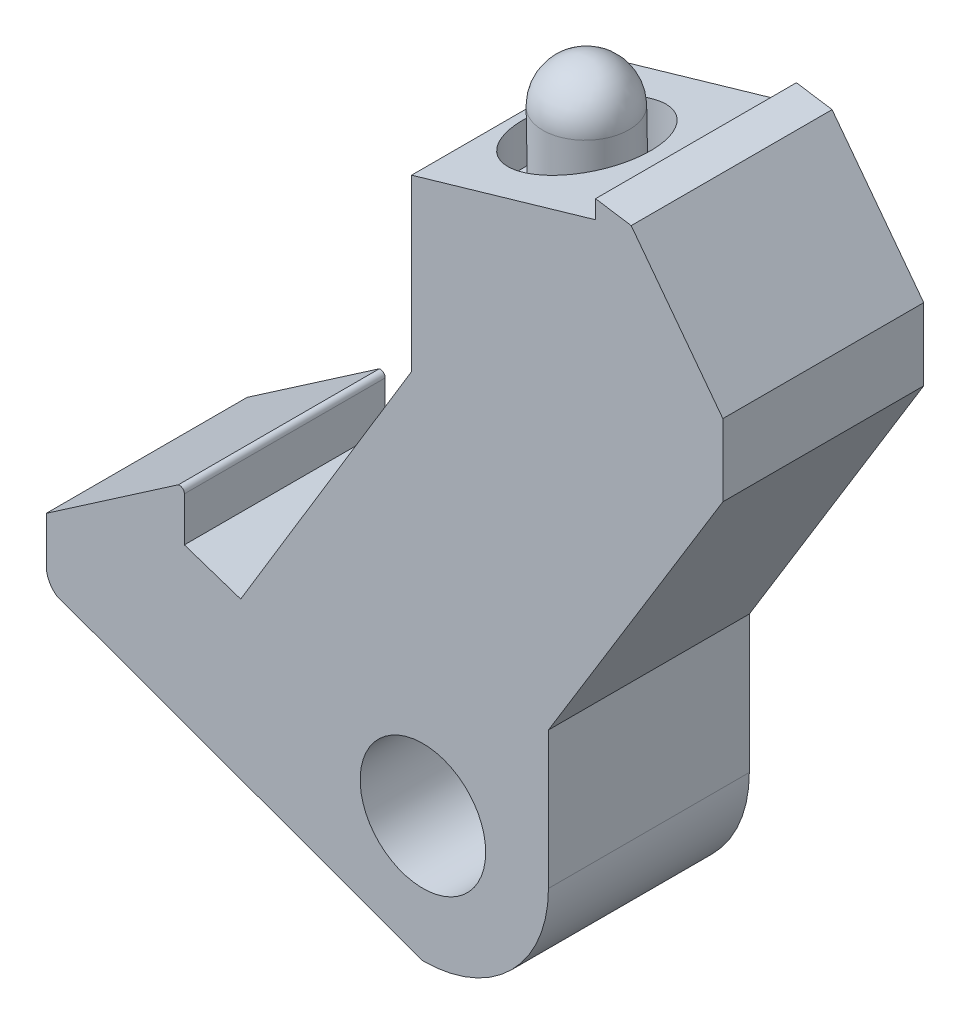
ISO-10303-21;
HEADER;
FILE_DESCRIPTION(('STEP AP214'),'2;1');
FILE_NAME('part.step','',(''),(''),'','','');
FILE_SCHEMA(('AUTOMOTIVE_DESIGN { 1 0 10303 214 1 1 1 1 }'));
ENDSEC;
DATA;
#1=APPLICATION_CONTEXT('core data for automotive mechanical design processes');
#2=APPLICATION_PROTOCOL_DEFINITION('international standard','automotive_design',2000,#1);
#3=PRODUCT_CONTEXT('',#1,'mechanical');
#4=PRODUCT('Part','Part','',(#3));
#5=PRODUCT_RELATED_PRODUCT_CATEGORY('part','',(#4));
#6=PRODUCT_DEFINITION_FORMATION('','',#4);
#7=PRODUCT_DEFINITION_CONTEXT('part definition',#1,'design');
#8=PRODUCT_DEFINITION('design','',#6,#7);
#9=PRODUCT_DEFINITION_SHAPE('','',#8);
#10=(LENGTH_UNIT() NAMED_UNIT(*) SI_UNIT(.MILLI.,.METRE.));
#11=(NAMED_UNIT(*) PLANE_ANGLE_UNIT() SI_UNIT($,.RADIAN.));
#12=(NAMED_UNIT(*) SI_UNIT($,.STERADIAN.) SOLID_ANGLE_UNIT());
#13=UNCERTAINTY_MEASURE_WITH_UNIT(LENGTH_MEASURE(1.E-05),#10,'distance_accuracy_value','');
#14=(GEOMETRIC_REPRESENTATION_CONTEXT(3) GLOBAL_UNCERTAINTY_ASSIGNED_CONTEXT((#13)) GLOBAL_UNIT_ASSIGNED_CONTEXT((#10,
#11,#12)) REPRESENTATION_CONTEXT('',''));
#15=CARTESIAN_POINT('',(0.,0.,0.));
#16=DIRECTION('',(0.,0.,1.));
#17=DIRECTION('',(1.,0.,0.));
#18=AXIS2_PLACEMENT_3D('',#15,#16,#17);
#19=CARTESIAN_POINT('',(-9.7,6.35896081746884,8.));
#20=DIRECTION('',(0.,0.,-1.));
#21=DIRECTION('',(-1.,0.,0.));
#22=AXIS2_PLACEMENT_3D('',#19,#20,#21);
#23=PLANE('',#22);
#24=DIRECTION('',(0.,1.,0.));
#25=VECTOR('',#24,1.);
#26=CARTESIAN_POINT('',(11.9457969008374,16.8074441873556,8.));
#27=LINE('',#26,#25);
#28=CARTESIAN_POINT('',(11.9457969008374,16.8074441873556,8.));
#29=VERTEX_POINT('',#28);
#30=CARTESIAN_POINT('',(11.9457969008374,19.6763086284542,8.));
#31=VERTEX_POINT('',#30);
#32=EDGE_CURVE('E220',#29,#31,#27,.T.);
#33=ORIENTED_EDGE('',*,*,#32,.T.);
#34=DIRECTION('',(-0.602727776871631,0.797946882309457,0.));
#35=VECTOR('',#34,1.);
#36=CARTESIAN_POINT('',(8.29557588581769,24.5088094529446,8.));
#37=LINE('',#36,#35);
#38=CARTESIAN_POINT('',(8.29557588581769,24.5088094529446,8.));
#39=VERTEX_POINT('',#38);
#40=EDGE_CURVE('E118',#31,#39,#37,.T.);
#41=ORIENTED_EDGE('',*,*,#40,.T.);
#42=DIRECTION('',(-0.988277949517768,0.152665302203731,0.));
#43=VECTOR('',#42,1.);
#44=CARTESIAN_POINT('',(6.87558196920024,24.7281645448129,8.));
#45=LINE('',#44,#43);
#46=CARTESIAN_POINT('',(6.87558196920024,24.7281645448129,8.));
#47=VERTEX_POINT('',#46);
#48=EDGE_CURVE('E299',#39,#47,#45,.T.);
#49=ORIENTED_EDGE('',*,*,#48,.T.);
#50=DIRECTION('',(0.,-1.,0.));
#51=VECTOR('',#50,1.);
#52=CARTESIAN_POINT('',(6.87558196920024,24.7281645448129,8.));
#53=LINE('',#52,#51);
#54=CARTESIAN_POINT('',(6.87558196920025,23.9999999999999,8.));
#55=VERTEX_POINT('',#54);
#56=EDGE_CURVE('E301',#47,#55,#53,.T.);
#57=ORIENTED_EDGE('',*,*,#56,.T.);
#58=DIRECTION('',(-0.960439074850142,-0.278490185645746,0.));
#59=VECTOR('',#58,1.);
#60=CARTESIAN_POINT('',(6.87558196920025,23.9999999999999,8.));
#61=LINE('',#60,#59);
#62=CARTESIAN_POINT('',(-0.451148657404047,21.8755314878272,8.));
#63=VERTEX_POINT('',#62);
#64=EDGE_CURVE('E303',#55,#63,#61,.T.);
#65=ORIENTED_EDGE('',*,*,#64,.T.);
#66=DIRECTION('',(0.,-1.,0.));
#67=VECTOR('',#66,1.);
#68=CARTESIAN_POINT('',(-0.451148657404047,15.1014958015658,8.));
#69=LINE('',#68,#67);
#70=CARTESIAN_POINT('',(-0.451148657404047,15.1014958015658,8.));
#71=VERTEX_POINT('',#70);
#72=EDGE_CURVE('E305',#63,#71,#69,.T.);
#73=ORIENTED_EDGE('',*,*,#72,.T.);
#74=DIRECTION('',(-0.517671811469476,-0.855579274883346,0.));
#75=VECTOR('',#74,1.);
#76=CARTESIAN_POINT('',(-7.25812043141713,3.85131017135029,8.));
#77=LINE('',#76,#75);
#78=CARTESIAN_POINT('',(-7.25812043141713,3.85131017135029,8.));
#79=VERTEX_POINT('',#78);
#80=EDGE_CURVE('E307',#71,#79,#77,.T.);
#81=ORIENTED_EDGE('',*,*,#80,.T.);
#82=DIRECTION('',(-0.948683298050514,0.316227766016838,0.));
#83=VECTOR('',#82,1.);
#84=CARTESIAN_POINT('',(-7.25812043141713,3.85131017135029,8.));
#85=LINE('',#84,#83);
#86=CARTESIAN_POINT('',(-9.5,4.59860336087792,8.));
#87=VERTEX_POINT('',#86);
#88=EDGE_CURVE('E309',#79,#87,#85,.T.);
#89=ORIENTED_EDGE('',*,*,#88,.T.);
#90=DIRECTION('',(0.,1.,0.));
#91=VECTOR('',#90,1.);
#92=CARTESIAN_POINT('',(-9.5,6.35896081746884,8.));
#93=LINE('',#92,#91);
#94=CARTESIAN_POINT('',(-9.5,6.35896081746884,8.));
#95=VERTEX_POINT('',#94);
#96=EDGE_CURVE('E311',#87,#95,#93,.T.);
#97=ORIENTED_EDGE('',*,*,#96,.T.);
#98=CARTESIAN_POINT('',(-9.7,6.35896081746884,8.));
#99=DIRECTION('',(0.,0.,1.));
#100=DIRECTION('',(-1.,0.,0.));
#101=AXIS2_PLACEMENT_3D('',#98,#99,#100);
#102=CIRCLE('',#101,0.200000000000001);
#103=CARTESIAN_POINT('',(-9.73577708764,6.55573479948883,8.));
#104=VERTEX_POINT('',#103);
#105=EDGE_CURVE('E313',#95,#104,#102,.T.);
#106=ORIENTED_EDGE('',*,*,#105,.T.);
#107=DIRECTION('',(-0.824143897152437,-0.566380469990265,0.));
#108=VECTOR('',#107,1.);
#109=CARTESIAN_POINT('',(-9.73577708764,6.55573479948883,8.));
#110=LINE('',#109,#108);
#111=CARTESIAN_POINT('',(-15.,2.93797695703222,8.));
#112=VERTEX_POINT('',#111);
#113=EDGE_CURVE('E315',#104,#112,#110,.T.);
#114=ORIENTED_EDGE('',*,*,#113,.T.);
#115=DIRECTION('',(0.,-1.,0.));
#116=VECTOR('',#115,1.);
#117=CARTESIAN_POINT('',(-15.,1.11192690659553,8.));
#118=LINE('',#117,#116);
#119=CARTESIAN_POINT('',(-15.,1.11192690659553,8.));
#120=VERTEX_POINT('',#119);
#121=EDGE_CURVE('E317',#112,#120,#118,.T.);
#122=ORIENTED_EDGE('',*,*,#121,.T.);
#123=CARTESIAN_POINT('',(-14.,1.11192690659553,8.));
#124=DIRECTION('',(0.,0.,1.));
#125=DIRECTION('',(-1.,0.,0.));
#126=AXIS2_PLACEMENT_3D('',#123,#124,#125);
#127=CIRCLE('',#126,1.);
#128=CARTESIAN_POINT('',(-14.5829032987937,0.299385372730662,8.));
#129=VERTEX_POINT('',#128);
#130=EDGE_CURVE('E319',#120,#129,#127,.T.);
#131=ORIENTED_EDGE('',*,*,#130,.T.);
#132=DIRECTION('',(0.939865612839729,-0.341544477047134,0.));
#133=VECTOR('',#132,1.);
#134=CARTESIAN_POINT('',(-14.5829032987937,0.299385372730663,8.));
#135=LINE('',#134,#133);
#136=CARTESIAN_POINT('',(0.,-5.,8.));
#137=VERTEX_POINT('',#136);
#138=EDGE_CURVE('E165',#129,#137,#135,.T.);
#139=ORIENTED_EDGE('',*,*,#138,.T.);
#140=CARTESIAN_POINT('',(0.,0.,8.));
#141=DIRECTION('',(0.,0.,1.));
#142=DIRECTION('',(1.,0.,0.));
#143=AXIS2_PLACEMENT_3D('',#140,#141,#142);
#144=CIRCLE('',#143,5.);
#145=CARTESIAN_POINT('',(5.,0.,8.));
#146=VERTEX_POINT('',#145);
#147=EDGE_CURVE('E158',#137,#146,#144,.T.);
#148=ORIENTED_EDGE('',*,*,#147,.T.);
#149=DIRECTION('',(0.,1.,0.));
#150=VECTOR('',#149,1.);
#151=CARTESIAN_POINT('',(5.,0.,8.));
#152=LINE('',#151,#150);
#153=CARTESIAN_POINT('',(5.,5.46493445676788,8.));
#154=VERTEX_POINT('',#153);
#155=EDGE_CURVE('E162',#146,#154,#152,.T.);
#156=ORIENTED_EDGE('',*,*,#155,.T.);
#157=DIRECTION('',(0.522230594168643,0.852804319005401,0.));
#158=VECTOR('',#157,1.);
#159=CARTESIAN_POINT('',(10.1123290730016,13.8133850498879,8.));
#160=LINE('',#159,#158);
#161=EDGE_CURVE('E50',#154,#29,#160,.T.);
#162=ORIENTED_EDGE('',*,*,#161,.T.);
#163=EDGE_LOOP('',(#33,#41,#49,#57,#65,#73,#81,#89,#97,#106,#114,#122,#131,#139,#148,#156,#162));
#164=FACE_BOUND('',#163,.T.);
#165=CARTESIAN_POINT('',(0.,0.,8.));
#166=DIRECTION('',(0.,0.,1.));
#167=DIRECTION('',(1.,0.,0.));
#168=AXIS2_PLACEMENT_3D('',#165,#166,#167);
#169=CIRCLE('',#168,2.5);
#170=CARTESIAN_POINT('',(2.5,0.,8.));
#171=VERTEX_POINT('',#170);
#172=EDGE_CURVE('E190',#171,#171,#169,.T.);
#173=ORIENTED_EDGE('',*,*,#172,.F.);
#174=EDGE_LOOP('',(#173));
#175=FACE_BOUND('',#174,.T.);
#176=ADVANCED_FACE('F33',(#164,#175),#23,.F.);
#177=CARTESIAN_POINT('',(-9.7,6.35896081746884,0.));
#178=DIRECTION('',(0.,0.,-1.));
#179=DIRECTION('',(-1.,0.,0.));
#180=AXIS2_PLACEMENT_3D('',#177,#178,#179);
#181=PLANE('',#180);
#182=DIRECTION('',(0.,1.,0.));
#183=VECTOR('',#182,1.);
#184=CARTESIAN_POINT('',(11.9457969008374,16.8074441873556,0.));
#185=LINE('',#184,#183);
#186=CARTESIAN_POINT('',(11.9457969008374,16.8074441873556,0.));
#187=VERTEX_POINT('',#186);
#188=CARTESIAN_POINT('',(11.9457969008374,19.6763086284542,0.));
#189=VERTEX_POINT('',#188);
#190=EDGE_CURVE('E186',#187,#189,#185,.T.);
#191=ORIENTED_EDGE('',*,*,#190,.F.);
#192=DIRECTION('',(0.522230594168643,0.852804319005401,0.));
#193=VECTOR('',#192,1.);
#194=CARTESIAN_POINT('',(10.1123290730016,13.8133850498879,0.));
#195=LINE('',#194,#193);
#196=CARTESIAN_POINT('',(5.,5.46493445676788,0.));
#197=VERTEX_POINT('',#196);
#198=EDGE_CURVE('E105',#197,#187,#195,.T.);
#199=ORIENTED_EDGE('',*,*,#198,.F.);
#200=DIRECTION('',(0.,1.,0.));
#201=VECTOR('',#200,1.);
#202=CARTESIAN_POINT('',(5.,5.46493445676788,0.));
#203=LINE('',#202,#201);
#204=CARTESIAN_POINT('',(5.,0.,0.));
#205=VERTEX_POINT('',#204);
#206=EDGE_CURVE('E217',#205,#197,#203,.T.);
#207=ORIENTED_EDGE('',*,*,#206,.F.);
#208=CARTESIAN_POINT('',(0.,0.,0.));
#209=DIRECTION('',(0.,0.,1.));
#210=DIRECTION('',(1.,0.,0.));
#211=AXIS2_PLACEMENT_3D('',#208,#209,#210);
#212=CIRCLE('',#211,5.);
#213=CARTESIAN_POINT('',(0.,-5.,0.));
#214=VERTEX_POINT('',#213);
#215=EDGE_CURVE('E175',#214,#205,#212,.T.);
#216=ORIENTED_EDGE('',*,*,#215,.F.);
#217=DIRECTION('',(0.939865612839729,-0.341544477047134,0.));
#218=VECTOR('',#217,1.);
#219=CARTESIAN_POINT('',(-14.5829032987937,0.299385372730663,0.));
#220=LINE('',#219,#218);
#221=CARTESIAN_POINT('',(-14.5829032987937,0.299385372730662,0.));
#222=VERTEX_POINT('',#221);
#223=EDGE_CURVE('E214',#222,#214,#220,.T.);
#224=ORIENTED_EDGE('',*,*,#223,.F.);
#225=CARTESIAN_POINT('',(-14.,1.11192690659553,0.));
#226=DIRECTION('',(0.,0.,1.));
#227=DIRECTION('',(-1.,0.,0.));
#228=AXIS2_PLACEMENT_3D('',#225,#226,#227);
#229=CIRCLE('',#228,1.);
#230=CARTESIAN_POINT('',(-15.,1.11192690659553,0.));
#231=VERTEX_POINT('',#230);
#232=EDGE_CURVE('E212',#231,#222,#229,.T.);
#233=ORIENTED_EDGE('',*,*,#232,.F.);
#234=DIRECTION('',(0.,-1.,0.));
#235=VECTOR('',#234,1.);
#236=CARTESIAN_POINT('',(-15.,1.11192690659553,0.));
#237=LINE('',#236,#235);
#238=CARTESIAN_POINT('',(-15.,2.93797695703222,0.));
#239=VERTEX_POINT('',#238);
#240=EDGE_CURVE('E210',#239,#231,#237,.T.);
#241=ORIENTED_EDGE('',*,*,#240,.F.);
#242=DIRECTION('',(-0.824143897152437,-0.566380469990265,0.));
#243=VECTOR('',#242,1.);
#244=CARTESIAN_POINT('',(-9.73577708764,6.55573479948883,0.));
#245=LINE('',#244,#243);
#246=CARTESIAN_POINT('',(-9.73577708764,6.55573479948883,0.));
#247=VERTEX_POINT('',#246);
#248=EDGE_CURVE('E208',#247,#239,#245,.T.);
#249=ORIENTED_EDGE('',*,*,#248,.F.);
#250=CARTESIAN_POINT('',(-9.7,6.35896081746884,0.));
#251=DIRECTION('',(0.,0.,1.));
#252=DIRECTION('',(-1.,0.,0.));
#253=AXIS2_PLACEMENT_3D('',#250,#251,#252);
#254=CIRCLE('',#253,0.200000000000001);
#255=CARTESIAN_POINT('',(-9.5,6.35896081746884,0.));
#256=VERTEX_POINT('',#255);
#257=EDGE_CURVE('E206',#256,#247,#254,.T.);
#258=ORIENTED_EDGE('',*,*,#257,.F.);
#259=DIRECTION('',(0.,1.,0.));
#260=VECTOR('',#259,1.);
#261=CARTESIAN_POINT('',(-9.5,6.35896081746884,0.));
#262=LINE('',#261,#260);
#263=CARTESIAN_POINT('',(-9.5,4.59860336087792,0.));
#264=VERTEX_POINT('',#263);
#265=EDGE_CURVE('E204',#264,#256,#262,.T.);
#266=ORIENTED_EDGE('',*,*,#265,.F.);
#267=DIRECTION('',(-0.948683298050514,0.316227766016838,0.));
#268=VECTOR('',#267,1.);
#269=CARTESIAN_POINT('',(-7.25812043141713,3.85131017135029,0.));
#270=LINE('',#269,#268);
#271=CARTESIAN_POINT('',(-7.25812043141713,3.85131017135029,0.));
#272=VERTEX_POINT('',#271);
#273=EDGE_CURVE('E202',#272,#264,#270,.T.);
#274=ORIENTED_EDGE('',*,*,#273,.F.);
#275=DIRECTION('',(-0.517671811469476,-0.855579274883346,0.));
#276=VECTOR('',#275,1.);
#277=CARTESIAN_POINT('',(-7.25812043141713,3.85131017135029,0.));
#278=LINE('',#277,#276);
#279=CARTESIAN_POINT('',(-0.451148657404047,15.1014958015658,0.));
#280=VERTEX_POINT('',#279);
#281=EDGE_CURVE('E200',#280,#272,#278,.T.);
#282=ORIENTED_EDGE('',*,*,#281,.F.);
#283=DIRECTION('',(0.,-1.,0.));
#284=VECTOR('',#283,1.);
#285=CARTESIAN_POINT('',(-0.451148657404047,15.1014958015658,0.));
#286=LINE('',#285,#284);
#287=CARTESIAN_POINT('',(-0.451148657404047,21.8755314878272,0.));
#288=VERTEX_POINT('',#287);
#289=EDGE_CURVE('E198',#288,#280,#286,.T.);
#290=ORIENTED_EDGE('',*,*,#289,.F.);
#291=DIRECTION('',(-0.960439074850142,-0.278490185645746,0.));
#292=VECTOR('',#291,1.);
#293=CARTESIAN_POINT('',(6.87558196920025,23.9999999999999,0.));
#294=LINE('',#293,#292);
#295=CARTESIAN_POINT('',(6.87558196920025,23.9999999999999,0.));
#296=VERTEX_POINT('',#295);
#297=EDGE_CURVE('E196',#296,#288,#294,.T.);
#298=ORIENTED_EDGE('',*,*,#297,.F.);
#299=DIRECTION('',(0.,-1.,0.));
#300=VECTOR('',#299,1.);
#301=CARTESIAN_POINT('',(6.87558196920024,24.7281645448129,0.));
#302=LINE('',#301,#300);
#303=CARTESIAN_POINT('',(6.87558196920024,24.7281645448129,0.));
#304=VERTEX_POINT('',#303);
#305=EDGE_CURVE('E194',#304,#296,#302,.T.);
#306=ORIENTED_EDGE('',*,*,#305,.F.);
#307=DIRECTION('',(-0.988277949517768,0.152665302203731,0.));
#308=VECTOR('',#307,1.);
#309=CARTESIAN_POINT('',(6.87558196920024,24.7281645448129,0.));
#310=LINE('',#309,#308);
#311=CARTESIAN_POINT('',(8.29557588581769,24.5088094529446,0.));
#312=VERTEX_POINT('',#311);
#313=EDGE_CURVE('E192',#312,#304,#310,.T.);
#314=ORIENTED_EDGE('',*,*,#313,.F.);
#315=DIRECTION('',(-0.602727776871631,0.797946882309457,0.));
#316=VECTOR('',#315,1.);
#317=CARTESIAN_POINT('',(8.29557588581769,24.5088094529446,0.));
#318=LINE('',#317,#316);
#319=EDGE_CURVE('E189',#189,#312,#318,.T.);
#320=ORIENTED_EDGE('',*,*,#319,.F.);
#321=EDGE_LOOP('',(#191,#199,#207,#216,#224,#233,#241,#249,#258,#266,#274,#282,#290,#298,#306,
#314,#320));
#322=FACE_BOUND('',#321,.T.);
#323=CARTESIAN_POINT('',(0.,0.,0.));
#324=DIRECTION('',(0.,0.,1.));
#325=DIRECTION('',(1.,0.,0.));
#326=AXIS2_PLACEMENT_3D('',#323,#324,#325);
#327=CIRCLE('',#326,2.5);
#328=CARTESIAN_POINT('',(2.5,0.,0.));
#329=VERTEX_POINT('',#328);
#330=EDGE_CURVE('E290',#329,#329,#327,.T.);
#331=ORIENTED_EDGE('',*,*,#330,.T.);
#332=EDGE_LOOP('',(#331));
#333=FACE_BOUND('',#332,.T.);
#334=ADVANCED_FACE('F330',(#322,#333),#181,.T.);
#335=CARTESIAN_POINT('',(11.9457969008374,16.8074441873556,8.));
#336=DIRECTION('',(-1.,0.,0.));
#337=DIRECTION('',(0.,0.,1.));
#338=AXIS2_PLACEMENT_3D('',#335,#336,#337);
#339=PLANE('',#338);
#340=ORIENTED_EDGE('',*,*,#190,.T.);
#341=DIRECTION('',(0.,0.,-1.));
#342=VECTOR('',#341,1.);
#343=CARTESIAN_POINT('',(11.9457969008374,19.6763086284542,8.));
#344=LINE('',#343,#342);
#345=EDGE_CURVE('E260',#31,#189,#344,.T.);
#346=ORIENTED_EDGE('',*,*,#345,.F.);
#347=ORIENTED_EDGE('',*,*,#32,.F.);
#348=DIRECTION('',(0.,0.,-1.));
#349=VECTOR('',#348,1.);
#350=CARTESIAN_POINT('',(11.9457969008374,16.8074441873556,8.));
#351=LINE('',#350,#349);
#352=EDGE_CURVE('E182',#29,#187,#351,.T.);
#353=ORIENTED_EDGE('',*,*,#352,.T.);
#354=EDGE_LOOP('',(#340,#346,#347,#353));
#355=FACE_BOUND('',#354,.T.);
#356=ADVANCED_FACE('F336',(#355),#339,.F.);
#357=CARTESIAN_POINT('',(8.29557588581769,24.5088094529446,8.));
#358=DIRECTION('',(-0.797946882309457,-0.602727776871631,0.));
#359=DIRECTION('',(0.602727776871631,-0.797946882309456,0.));
#360=AXIS2_PLACEMENT_3D('',#357,#358,#359);
#361=PLANE('',#360);
#362=ORIENTED_EDGE('',*,*,#319,.T.);
#363=DIRECTION('',(0.,0.,-1.));
#364=VECTOR('',#363,1.);
#365=CARTESIAN_POINT('',(8.29557588581769,24.5088094529446,8.));
#366=LINE('',#365,#364);
#367=EDGE_CURVE('E257',#39,#312,#366,.T.);
#368=ORIENTED_EDGE('',*,*,#367,.F.);
#369=ORIENTED_EDGE('',*,*,#40,.F.);
#370=ORIENTED_EDGE('',*,*,#345,.T.);
#371=EDGE_LOOP('',(#362,#368,#369,#370));
#372=FACE_BOUND('',#371,.T.);
#373=ADVANCED_FACE('F339',(#372),#361,.F.);
#374=CARTESIAN_POINT('',(6.87558196920024,24.7281645448129,8.));
#375=DIRECTION('',(-0.152665302203731,-0.988277949517768,0.));
#376=DIRECTION('',(0.988277949517768,-0.152665302203731,0.));
#377=AXIS2_PLACEMENT_3D('',#374,#375,#376);
#378=PLANE('',#377);
#379=ORIENTED_EDGE('',*,*,#313,.T.);
#380=DIRECTION('',(0.,0.,-1.));
#381=VECTOR('',#380,1.);
#382=CARTESIAN_POINT('',(6.87558196920024,24.7281645448129,8.));
#383=LINE('',#382,#381);
#384=EDGE_CURVE('E254',#47,#304,#383,.T.);
#385=ORIENTED_EDGE('',*,*,#384,.F.);
#386=ORIENTED_EDGE('',*,*,#48,.F.);
#387=ORIENTED_EDGE('',*,*,#367,.T.);
#388=EDGE_LOOP('',(#379,#385,#386,#387));
#389=FACE_BOUND('',#388,.T.);
#390=ADVANCED_FACE('F342',(#389),#378,.F.);
#391=CARTESIAN_POINT('',(6.87558196920024,24.7281645448129,8.));
#392=DIRECTION('',(1.,0.,0.));
#393=DIRECTION('',(0.,1.,0.));
#394=AXIS2_PLACEMENT_3D('',#391,#392,#393);
#395=PLANE('',#394);
#396=ORIENTED_EDGE('',*,*,#305,.T.);
#397=DIRECTION('',(0.,0.,-1.));
#398=VECTOR('',#397,1.);
#399=CARTESIAN_POINT('',(6.87558196920025,23.9999999999999,8.));
#400=LINE('',#399,#398);
#401=EDGE_CURVE('E251',#55,#296,#400,.T.);
#402=ORIENTED_EDGE('',*,*,#401,.F.);
#403=ORIENTED_EDGE('',*,*,#56,.F.);
#404=ORIENTED_EDGE('',*,*,#384,.T.);
#405=EDGE_LOOP('',(#396,#402,#403,#404));
#406=FACE_BOUND('',#405,.T.);
#407=ADVANCED_FACE('F347',(#406),#395,.F.);
#408=CARTESIAN_POINT('',(6.87558196920025,23.9999999999999,8.));
#409=DIRECTION('',(0.278490185645746,-0.960439074850142,0.));
#410=DIRECTION('',(0.960439074850143,0.278490185645746,0.));
#411=AXIS2_PLACEMENT_3D('',#408,#409,#410);
#412=PLANE('',#411);
#413=CARTESIAN_POINT('',(2.53172764381461,22.7404502490868,4.));
#414=DIRECTION('',(0.278490185645746,-0.960439074850142,0.));
#415=DIRECTION('',(-0.960439074850143,-0.278490185645746,0.));
#416=AXIS2_PLACEMENT_3D('',#413,#414,#415);
#417=ELLIPSE('',#416,2.63988099029755,2.55);
#418=CARTESIAN_POINT('',(-0.00371721222124869,22.0052693020162,4.));
#419=VERTEX_POINT('',#418);
#420=EDGE_CURVE('E265',#419,#419,#417,.T.);
#421=ORIENTED_EDGE('',*,*,#420,.T.);
#422=EDGE_LOOP('',(#421));
#423=FACE_BOUND('',#422,.T.);
#424=ORIENTED_EDGE('',*,*,#297,.T.);
#425=DIRECTION('',(0.,0.,-1.));
#426=VECTOR('',#425,1.);
#427=CARTESIAN_POINT('',(-0.451148657404047,21.8755314878272,8.));
#428=LINE('',#427,#426);
#429=EDGE_CURVE('E248',#63,#288,#428,.T.);
#430=ORIENTED_EDGE('',*,*,#429,.F.);
#431=ORIENTED_EDGE('',*,*,#64,.F.);
#432=ORIENTED_EDGE('',*,*,#401,.T.);
#433=EDGE_LOOP('',(#424,#430,#431,#432));
#434=FACE_BOUND('',#433,.T.);
#435=ADVANCED_FACE('F353',(#423,#434),#412,.F.);
#436=CARTESIAN_POINT('',(-0.451148657404047,15.1014958015658,8.));
#437=DIRECTION('',(1.,0.,0.));
#438=DIRECTION('',(0.,0.,-1.));
#439=AXIS2_PLACEMENT_3D('',#436,#437,#438);
#440=PLANE('',#439);
#441=ORIENTED_EDGE('',*,*,#289,.T.);
#442=DIRECTION('',(0.,0.,-1.));
#443=VECTOR('',#442,1.);
#444=CARTESIAN_POINT('',(-0.451148657404047,15.1014958015658,8.));
#445=LINE('',#444,#443);
#446=EDGE_CURVE('E245',#71,#280,#445,.T.);
#447=ORIENTED_EDGE('',*,*,#446,.F.);
#448=ORIENTED_EDGE('',*,*,#72,.F.);
#449=ORIENTED_EDGE('',*,*,#429,.T.);
#450=EDGE_LOOP('',(#441,#447,#448,#449));
#451=FACE_BOUND('',#450,.T.);
#452=ADVANCED_FACE('F357',(#451),#440,.F.);
#453=CARTESIAN_POINT('',(-7.25812043141713,3.85131017135029,8.));
#454=DIRECTION('',(0.855579274883346,-0.517671811469476,0.));
#455=DIRECTION('',(0.517671811469476,0.855579274883346,0.));
#456=AXIS2_PLACEMENT_3D('',#453,#454,#455);
#457=PLANE('',#456);
#458=ORIENTED_EDGE('',*,*,#281,.T.);
#459=DIRECTION('',(0.,0.,-1.));
#460=VECTOR('',#459,1.);
#461=CARTESIAN_POINT('',(-7.25812043141713,3.85131017135029,8.));
#462=LINE('',#461,#460);
#463=EDGE_CURVE('E242',#79,#272,#462,.T.);
#464=ORIENTED_EDGE('',*,*,#463,.F.);
#465=ORIENTED_EDGE('',*,*,#80,.F.);
#466=ORIENTED_EDGE('',*,*,#446,.T.);
#467=EDGE_LOOP('',(#458,#464,#465,#466));
#468=FACE_BOUND('',#467,.T.);
#469=ADVANCED_FACE('F362',(#468),#457,.F.);
#470=CARTESIAN_POINT('',(-7.25812043141713,3.85131017135029,8.));
#471=DIRECTION('',(-0.316227766016838,-0.948683298050514,0.));
#472=DIRECTION('',(0.948683298050514,-0.316227766016838,0.));
#473=AXIS2_PLACEMENT_3D('',#470,#471,#472);
#474=PLANE('',#473);
#475=ORIENTED_EDGE('',*,*,#273,.T.);
#476=DIRECTION('',(0.,0.,-1.));
#477=VECTOR('',#476,1.);
#478=CARTESIAN_POINT('',(-9.5,4.59860336087792,8.));
#479=LINE('',#478,#477);
#480=EDGE_CURVE('E239',#87,#264,#479,.T.);
#481=ORIENTED_EDGE('',*,*,#480,.F.);
#482=ORIENTED_EDGE('',*,*,#88,.F.);
#483=ORIENTED_EDGE('',*,*,#463,.T.);
#484=EDGE_LOOP('',(#475,#481,#482,#483));
#485=FACE_BOUND('',#484,.T.);
#486=ADVANCED_FACE('F368',(#485),#474,.F.);
#487=CARTESIAN_POINT('',(-9.5,6.35896081746884,8.));
#488=DIRECTION('',(-1.,0.,0.));
#489=DIRECTION('',(0.,-1.,0.));
#490=AXIS2_PLACEMENT_3D('',#487,#488,#489);
#491=PLANE('',#490);
#492=ORIENTED_EDGE('',*,*,#265,.T.);
#493=DIRECTION('',(0.,0.,-1.));
#494=VECTOR('',#493,1.);
#495=CARTESIAN_POINT('',(-9.5,6.35896081746884,8.));
#496=LINE('',#495,#494);
#497=EDGE_CURVE('E236',#95,#256,#496,.T.);
#498=ORIENTED_EDGE('',*,*,#497,.F.);
#499=ORIENTED_EDGE('',*,*,#96,.F.);
#500=ORIENTED_EDGE('',*,*,#480,.T.);
#501=EDGE_LOOP('',(#492,#498,#499,#500));
#502=FACE_BOUND('',#501,.T.);
#503=ADVANCED_FACE('F372',(#502),#491,.F.);
#504=CARTESIAN_POINT('',(-9.7,6.35896081746884,8.));
#505=DIRECTION('',(0.,0.,-1.));
#506=DIRECTION('',(-1.,0.,0.));
#507=AXIS2_PLACEMENT_3D('',#504,#505,#506);
#508=CYLINDRICAL_SURFACE('',#507,0.200000000000001);
#509=ORIENTED_EDGE('',*,*,#257,.T.);
#510=DIRECTION('',(0.,0.,-1.));
#511=VECTOR('',#510,1.);
#512=CARTESIAN_POINT('',(-9.73577708764,6.55573479948883,8.));
#513=LINE('',#512,#511);
#514=EDGE_CURVE('E233',#104,#247,#513,.T.);
#515=ORIENTED_EDGE('',*,*,#514,.F.);
#516=ORIENTED_EDGE('',*,*,#105,.F.);
#517=ORIENTED_EDGE('',*,*,#497,.T.);
#518=EDGE_LOOP('',(#509,#515,#516,#517));
#519=FACE_BOUND('',#518,.T.);
#520=ADVANCED_FACE('F377',(#519),#508,.T.);
#521=CARTESIAN_POINT('',(-9.73577708764,6.55573479948883,8.));
#522=DIRECTION('',(0.566380469990265,-0.824143897152437,0.));
#523=DIRECTION('',(0.824143897152437,0.566380469990265,0.));
#524=AXIS2_PLACEMENT_3D('',#521,#522,#523);
#525=PLANE('',#524);
#526=ORIENTED_EDGE('',*,*,#248,.T.);
#527=DIRECTION('',(0.,0.,-1.));
#528=VECTOR('',#527,1.);
#529=CARTESIAN_POINT('',(-15.,2.93797695703222,8.));
#530=LINE('',#529,#528);
#531=EDGE_CURVE('E230',#112,#239,#530,.T.);
#532=ORIENTED_EDGE('',*,*,#531,.F.);
#533=ORIENTED_EDGE('',*,*,#113,.F.);
#534=ORIENTED_EDGE('',*,*,#514,.T.);
#535=EDGE_LOOP('',(#526,#532,#533,#534));
#536=FACE_BOUND('',#535,.T.);
#537=ADVANCED_FACE('F381',(#536),#525,.F.);
#538=CARTESIAN_POINT('',(-15.,1.11192690659553,8.));
#539=DIRECTION('',(1.,0.,0.));
#540=DIRECTION('',(0.,0.,-1.));
#541=AXIS2_PLACEMENT_3D('',#538,#539,#540);
#542=PLANE('',#541);
#543=ORIENTED_EDGE('',*,*,#240,.T.);
#544=DIRECTION('',(0.,0.,-1.));
#545=VECTOR('',#544,1.);
#546=CARTESIAN_POINT('',(-15.,1.11192690659553,8.));
#547=LINE('',#546,#545);
#548=EDGE_CURVE('E227',#120,#231,#547,.T.);
#549=ORIENTED_EDGE('',*,*,#548,.F.);
#550=ORIENTED_EDGE('',*,*,#121,.F.);
#551=ORIENTED_EDGE('',*,*,#531,.T.);
#552=EDGE_LOOP('',(#543,#549,#550,#551));
#553=FACE_BOUND('',#552,.T.);
#554=ADVANCED_FACE('F385',(#553),#542,.F.);
#555=CARTESIAN_POINT('',(-14.,1.11192690659553,8.));
#556=DIRECTION('',(0.,0.,-1.));
#557=DIRECTION('',(-1.,0.,0.));
#558=AXIS2_PLACEMENT_3D('',#555,#556,#557);
#559=CYLINDRICAL_SURFACE('',#558,1.);
#560=ORIENTED_EDGE('',*,*,#232,.T.);
#561=DIRECTION('',(0.,0.,-1.));
#562=VECTOR('',#561,1.);
#563=CARTESIAN_POINT('',(-14.5829032987937,0.299385372730662,8.));
#564=LINE('',#563,#562);
#565=EDGE_CURVE('E224',#129,#222,#564,.T.);
#566=ORIENTED_EDGE('',*,*,#565,.F.);
#567=ORIENTED_EDGE('',*,*,#130,.F.);
#568=ORIENTED_EDGE('',*,*,#548,.T.);
#569=EDGE_LOOP('',(#560,#566,#567,#568));
#570=FACE_BOUND('',#569,.T.);
#571=ADVANCED_FACE('F325',(#570),#559,.T.);
#572=CARTESIAN_POINT('',(-14.5829032987937,0.299385372730663,8.));
#573=DIRECTION('',(0.341544477047134,0.939865612839729,0.));
#574=DIRECTION('',(-0.939865612839729,0.341544477047134,0.));
#575=AXIS2_PLACEMENT_3D('',#572,#573,#574);
#576=PLANE('',#575);
#577=CARTESIAN_POINT('',(-10.9371774740952,-1.02546097045201,4.));
#578=DIRECTION('',(-0.341544477047134,-0.939865612839729,0.));
#579=DIRECTION('',(0.939865612839729,-0.341544477047134,0.));
#580=AXIS2_PLACEMENT_3D('',#577,#578,#579);
#581=CIRCLE('',#580,3.);
#582=CARTESIAN_POINT('',(-8.11758063557606,-2.05009440159341,4.));
#583=VERTEX_POINT('',#582);
#584=EDGE_CURVE('E286',#583,#583,#581,.T.);
#585=ORIENTED_EDGE('',*,*,#584,.F.);
#586=EDGE_LOOP('',(#585));
#587=FACE_BOUND('',#586,.T.);
#588=ORIENTED_EDGE('',*,*,#223,.T.);
#589=DIRECTION('',(0.,0.,-1.));
#590=VECTOR('',#589,1.);
#591=CARTESIAN_POINT('',(0.,-5.,8.));
#592=LINE('',#591,#590);
#593=EDGE_CURVE('E177',#137,#214,#592,.T.);
#594=ORIENTED_EDGE('',*,*,#593,.F.);
#595=ORIENTED_EDGE('',*,*,#138,.F.);
#596=ORIENTED_EDGE('',*,*,#565,.T.);
#597=EDGE_LOOP('',(#588,#594,#595,#596));
#598=FACE_BOUND('',#597,.T.);
#599=ADVANCED_FACE('F329',(#587,#598),#576,.F.);
#600=CARTESIAN_POINT('',(0.,0.,8.));
#601=DIRECTION('',(0.,0.,-1.));
#602=DIRECTION('',(-1.,0.,0.));
#603=AXIS2_PLACEMENT_3D('',#600,#601,#602);
#604=CYLINDRICAL_SURFACE('',#603,5.);
#605=ORIENTED_EDGE('',*,*,#215,.T.);
#606=DIRECTION('',(0.,0.,-1.));
#607=VECTOR('',#606,1.);
#608=CARTESIAN_POINT('',(5.,0.,8.));
#609=LINE('',#608,#607);
#610=EDGE_CURVE('E172',#146,#205,#609,.T.);
#611=ORIENTED_EDGE('',*,*,#610,.F.);
#612=ORIENTED_EDGE('',*,*,#147,.F.);
#613=ORIENTED_EDGE('',*,*,#593,.T.);
#614=EDGE_LOOP('',(#605,#611,#612,#613));
#615=FACE_BOUND('',#614,.T.);
#616=ADVANCED_FACE('F173',(#615),#604,.T.);
#617=CARTESIAN_POINT('',(5.,5.46493445676788,8.));
#618=DIRECTION('',(-1.,0.,0.));
#619=DIRECTION('',(0.,0.,1.));
#620=AXIS2_PLACEMENT_3D('',#617,#618,#619);
#621=PLANE('',#620);
#622=ORIENTED_EDGE('',*,*,#206,.T.);
#623=DIRECTION('',(0.,0.,-1.));
#624=VECTOR('',#623,1.);
#625=CARTESIAN_POINT('',(5.,5.46493445676788,8.));
#626=LINE('',#625,#624);
#627=EDGE_CURVE('E178',#154,#197,#626,.T.);
#628=ORIENTED_EDGE('',*,*,#627,.F.);
#629=ORIENTED_EDGE('',*,*,#155,.F.);
#630=ORIENTED_EDGE('',*,*,#610,.T.);
#631=EDGE_LOOP('',(#622,#628,#629,#630));
#632=FACE_BOUND('',#631,.T.);
#633=ADVANCED_FACE('F180',(#632),#621,.F.);
#634=CARTESIAN_POINT('',(10.1123290730016,13.8133850498879,8.));
#635=DIRECTION('',(-0.852804319005401,0.522230594168643,0.));
#636=DIRECTION('',(-0.522230594168643,-0.852804319005401,0.));
#637=AXIS2_PLACEMENT_3D('',#634,#635,#636);
#638=PLANE('',#637);
#639=ORIENTED_EDGE('',*,*,#198,.T.);
#640=ORIENTED_EDGE('',*,*,#352,.F.);
#641=ORIENTED_EDGE('',*,*,#161,.F.);
#642=ORIENTED_EDGE('',*,*,#627,.T.);
#643=EDGE_LOOP('',(#639,#640,#641,#642));
#644=FACE_BOUND('',#643,.T.);
#645=ADVANCED_FACE('F332',(#644),#638,.F.);
#646=CARTESIAN_POINT('',(0.,0.,8.));
#647=DIRECTION('',(0.,0.,-1.));
#648=DIRECTION('',(-1.,0.,0.));
#649=AXIS2_PLACEMENT_3D('',#646,#647,#648);
#650=CYLINDRICAL_SURFACE('',#649,2.5);
#651=ORIENTED_EDGE('',*,*,#172,.T.);
#652=EDGE_LOOP('',(#651));
#653=FACE_BOUND('',#652,.T.);
#654=ORIENTED_EDGE('',*,*,#330,.F.);
#655=EDGE_LOOP('',(#654));
#656=FACE_BOUND('',#655,.T.);
#657=ADVANCED_FACE('F401',(#653,#656),#650,.F.);
#658=CARTESIAN_POINT('',(-9.91254404295385,1.79413586806718,4.));
#659=DIRECTION('',(-0.341544477047134,-0.939865612839729,0.));
#660=DIRECTION('',(0.939865612839729,-0.341544477047134,0.));
#661=AXIS2_PLACEMENT_3D('',#658,#659,#660);
#662=CYLINDRICAL_SURFACE('',#661,3.);
#663=CARTESIAN_POINT('',(-9.91254404295385,1.79413586806718,4.));
#664=DIRECTION('',(-0.341544477047134,-0.939865612839729,0.));
#665=DIRECTION('',(0.939865612839729,-0.341544477047134,0.));
#666=AXIS2_PLACEMENT_3D('',#663,#664,#665);
#667=CIRCLE('',#666,3.);
#668=CARTESIAN_POINT('',(-7.09294720443466,0.769502436925783,4.));
#669=VERTEX_POINT('',#668);
#670=EDGE_CURVE('E287',#669,#669,#667,.T.);
#671=ORIENTED_EDGE('',*,*,#670,.F.);
#672=EDGE_LOOP('',(#671));
#673=FACE_BOUND('',#672,.T.);
#674=ORIENTED_EDGE('',*,*,#584,.T.);
#675=EDGE_LOOP('',(#674));
#676=FACE_BOUND('',#675,.T.);
#677=ADVANCED_FACE('F416',(#673,#676),#662,.F.);
#678=CARTESIAN_POINT('',(-9.91254404295385,1.79413586806718,4.));
#679=DIRECTION('',(-0.341544477047134,-0.939865612839729,0.));
#680=DIRECTION('',(0.939865612839729,-0.341544477047134,0.));
#681=AXIS2_PLACEMENT_3D('',#678,#679,#680);
#682=PLANE('',#681);
#683=CARTESIAN_POINT('',(-9.91254404295385,1.79413586806718,4.));
#684=DIRECTION('',(-0.341544477047134,-0.939865612839729,0.));
#685=DIRECTION('',(0.939865612839729,-0.341544477047134,0.));
#686=AXIS2_PLACEMENT_3D('',#683,#684,#685);
#687=CIRCLE('',#686,2.);
#688=CARTESIAN_POINT('',(-8.03281281727439,1.11104691397292,4.));
#689=VERTEX_POINT('',#688);
#690=EDGE_CURVE('E267',#689,#689,#687,.T.);
#691=ORIENTED_EDGE('',*,*,#690,.F.);
#692=EDGE_LOOP('',(#691));
#693=FACE_BOUND('',#692,.T.);
#694=ORIENTED_EDGE('',*,*,#670,.T.);
#695=EDGE_LOOP('',(#694));
#696=FACE_BOUND('',#695,.T.);
#697=ADVANCED_FACE('F418',(#693,#696),#682,.T.);
#698=CARTESIAN_POINT('',(-10.9371774740952,-1.025460970452,4.));
#699=DIRECTION('',(0.341544477047134,0.939865612839729,0.));
#700=DIRECTION('',(-0.939865612839729,0.341544477047134,0.));
#701=AXIS2_PLACEMENT_3D('',#698,#699,#700);
#702=CYLINDRICAL_SURFACE('',#701,2.);
#703=CARTESIAN_POINT('',(-10.254088520001,0.854270255227455,4.));
#704=DIRECTION('',(0.341544477047134,0.939865612839729,0.));
#705=DIRECTION('',(-0.939865612839729,0.341544477047134,0.));
#706=AXIS2_PLACEMENT_3D('',#703,#704,#705);
#707=CIRCLE('',#706,2.);
#708=CARTESIAN_POINT('',(-12.1338197456804,1.53735920932172,4.));
#709=VERTEX_POINT('',#708);
#710=EDGE_CURVE('E262',#709,#709,#707,.T.);
#711=ORIENTED_EDGE('',*,*,#710,.T.);
#712=EDGE_LOOP('',(#711));
#713=FACE_BOUND('',#712,.T.);
#714=ORIENTED_EDGE('',*,*,#690,.T.);
#715=EDGE_LOOP('',(#714));
#716=FACE_BOUND('',#715,.T.);
#717=ADVANCED_FACE('F424',(#713,#716),#702,.T.);
#718=CARTESIAN_POINT('',(-10.254088520001,0.854270255227455,4.));
#719=DIRECTION('',(-0.341544477047134,-0.939865612839729,0.));
#720=DIRECTION('',(0.939865612839729,-0.341544477047134,0.));
#721=AXIS2_PLACEMENT_3D('',#718,#719,#720);
#722=SPHERICAL_SURFACE('',#721,2.);
#723=ORIENTED_EDGE('',*,*,#710,.F.);
#724=EDGE_LOOP('',(#723));
#725=FACE_BOUND('',#724,.T.);
#726=ADVANCED_FACE('F432',(#725),#722,.T.);
#727=CARTESIAN_POINT('',(2.51743261273699,23.4367890714975,4.));
#728=DIRECTION('',(0.020524519626589,-0.999789349860308,0.));
#729=DIRECTION('',(0.999789349860308,0.020524519626589,0.));
#730=AXIS2_PLACEMENT_3D('',#727,#728,#729);
#731=CYLINDRICAL_SURFACE('',#730,2.55);
#732=CARTESIAN_POINT('',(2.57900617161676,20.4374210219165,4.));
#733=DIRECTION('',(0.020524519626589,-0.999789349860308,0.));
#734=DIRECTION('',(0.999789349860308,0.020524519626589,0.));
#735=AXIS2_PLACEMENT_3D('',#732,#733,#734);
#736=CIRCLE('',#735,2.55);
#737=CARTESIAN_POINT('',(5.12846901376055,20.4897585469644,4.));
#738=VERTEX_POINT('',#737);
#739=EDGE_CURVE('E268',#738,#738,#736,.T.);
#740=ORIENTED_EDGE('',*,*,#739,.T.);
#741=EDGE_LOOP('',(#740));
#742=FACE_BOUND('',#741,.T.);
#743=ORIENTED_EDGE('',*,*,#420,.F.);
#744=EDGE_LOOP('',(#743));
#745=FACE_BOUND('',#744,.T.);
#746=ADVANCED_FACE('F277',(#742,#745),#731,.F.);
#747=CARTESIAN_POINT('',(2.57900617161676,20.4374210219165,4.));
#748=DIRECTION('',(0.020524519626589,-0.999789349860308,0.));
#749=DIRECTION('',(0.999789349860308,0.020524519626589,0.));
#750=AXIS2_PLACEMENT_3D('',#747,#748,#749);
#751=PLANE('',#750);
#752=CARTESIAN_POINT('',(2.57900617161676,20.4374210219165,4.));
#753=DIRECTION('',(0.020524519626589,-0.999789349860308,0.));
#754=DIRECTION('',(0.999789349860308,0.020524519626589,0.));
#755=AXIS2_PLACEMENT_3D('',#752,#753,#754);
#756=CIRCLE('',#755,1.7);
#757=CARTESIAN_POINT('',(4.27864806637929,20.4723127052817,4.));
#758=VERTEX_POINT('',#757);
#759=EDGE_CURVE('E42',#758,#758,#756,.F.);
#760=ORIENTED_EDGE('',*,*,#759,.F.);
#761=EDGE_LOOP('',(#760));
#762=FACE_BOUND('',#761,.T.);
#763=ORIENTED_EDGE('',*,*,#739,.F.);
#764=EDGE_LOOP('',(#763));
#765=FACE_BOUND('',#764,.T.);
#766=ADVANCED_FACE('F274',(#762,#765),#751,.F.);
#767=CARTESIAN_POINT('',(2.47638357348382,25.4363677712181,4.));
#768=DIRECTION('',(0.020524519626589,-0.999789349860308,0.));
#769=DIRECTION('',(0.999789349860308,0.020524519626589,0.));
#770=AXIS2_PLACEMENT_3D('',#767,#768,#769);
#771=CYLINDRICAL_SURFACE('',#770,1.7);
#772=CARTESIAN_POINT('',(2.51127525684902,23.7367258764556,4.));
#773=DIRECTION('',(0.020524519626589,-0.999789349860308,0.));
#774=DIRECTION('',(0.999789349860308,0.020524519626589,0.));
#775=AXIS2_PLACEMENT_3D('',#772,#773,#774);
#776=CIRCLE('',#775,1.7);
#777=CARTESIAN_POINT('',(4.21091715161154,23.7716175598208,4.));
#778=VERTEX_POINT('',#777);
#779=EDGE_CURVE('E11',#778,#778,#776,.T.);
#780=CARTESIAN_POINT('',(4.21091715161154,23.7716175598208,4.));
#781=CARTESIAN_POINT('',(4.21162268197371,23.7372498009193,4.));
#782=CARTESIAN_POINT('',(4.21232821233587,23.7028820420179,4.));
#783=CARTESIAN_POINT('',(4.2137392730602,23.634146524215,4.));
#784=CARTESIAN_POINT('',(4.21444480342236,23.5997787653135,4.));
#785=CARTESIAN_POINT('',(4.21585586414669,23.5310432475106,4.));
#786=CARTESIAN_POINT('',(4.21656139450885,23.4966754886092,4.));
#787=CARTESIAN_POINT('',(4.21797245523318,23.4279399708063,4.));
#788=CARTESIAN_POINT('',(4.21867798559535,23.3935722119048,4.));
#789=CARTESIAN_POINT('',(4.22008904631967,23.3248366941019,4.));
#790=CARTESIAN_POINT('',(4.22079457668184,23.2904689352005,4.));
#791=CARTESIAN_POINT('',(4.22220563740617,23.2217334173976,4.));
#792=CARTESIAN_POINT('',(4.22291116776833,23.1873656584962,4.));
#793=CARTESIAN_POINT('',(4.22432222849266,23.1186301406933,4.));
#794=CARTESIAN_POINT('',(4.22502775885482,23.0842623817918,4.));
#795=CARTESIAN_POINT('',(4.22643881957915,23.0155268639889,4.));
#796=CARTESIAN_POINT('',(4.22714434994131,22.9811591050875,4.));
#797=CARTESIAN_POINT('',(4.22855541066564,22.9124235872846,4.));
#798=CARTESIAN_POINT('',(4.22926094102781,22.8780558283831,4.));
#799=CARTESIAN_POINT('',(4.23067200175213,22.8093203105802,4.));
#800=CARTESIAN_POINT('',(4.2313775321143,22.7749525516788,4.));
#801=CARTESIAN_POINT('',(4.23278859283863,22.7062170338759,4.));
#802=CARTESIAN_POINT('',(4.23349412320079,22.6718492749744,4.));
#803=CARTESIAN_POINT('',(4.23490518392512,22.6031137571715,4.));
#804=CARTESIAN_POINT('',(4.23561071428728,22.5687459982701,4.));
#805=CARTESIAN_POINT('',(4.23702177501161,22.5000104804672,4.));
#806=CARTESIAN_POINT('',(4.23772730537377,22.4656427215657,4.));
#807=CARTESIAN_POINT('',(4.2391383660981,22.3969072037628,4.));
#808=CARTESIAN_POINT('',(4.23984389646027,22.3625394448614,4.));
#809=CARTESIAN_POINT('',(4.24125495718459,22.2938039270585,4.));
#810=CARTESIAN_POINT('',(4.24196048754676,22.2594361681571,4.));
#811=CARTESIAN_POINT('',(4.24337154827109,22.1907006503542,4.));
#812=CARTESIAN_POINT('',(4.24407707863325,22.1563328914527,4.));
#813=CARTESIAN_POINT('',(4.24548813935758,22.0875973736498,4.));
#814=CARTESIAN_POINT('',(4.24619366971974,22.0532296147484,4.));
#815=CARTESIAN_POINT('',(4.24760473044407,21.9844940969455,4.));
#816=CARTESIAN_POINT('',(4.24831026080623,21.950126338044,4.));
#817=CARTESIAN_POINT('',(4.24972132153056,21.8813908202411,4.));
#818=CARTESIAN_POINT('',(4.25042685189273,21.8470230613397,4.));
#819=CARTESIAN_POINT('',(4.25183791261705,21.7782875435368,4.));
#820=CARTESIAN_POINT('',(4.25254344297922,21.7439197846353,4.));
#821=CARTESIAN_POINT('',(4.25395450370355,21.6751842668324,4.));
#822=CARTESIAN_POINT('',(4.25466003406571,21.640816507931,4.));
#823=CARTESIAN_POINT('',(4.25607109479004,21.5720809901281,4.));
#824=CARTESIAN_POINT('',(4.2567766251522,21.5377132312266,4.));
#825=CARTESIAN_POINT('',(4.25818768587653,21.4689777134237,4.));
#826=CARTESIAN_POINT('',(4.25889321623869,21.4346099545223,4.));
#827=CARTESIAN_POINT('',(4.26030427696302,21.3658744367194,4.));
#828=CARTESIAN_POINT('',(4.26100980732519,21.331506677818,4.));
#829=CARTESIAN_POINT('',(4.26242086804951,21.2627711600151,4.));
#830=CARTESIAN_POINT('',(4.26312639841168,21.2284034011136,4.));
#831=CARTESIAN_POINT('',(4.26453745913601,21.1596678833107,4.));
#832=CARTESIAN_POINT('',(4.26524298949817,21.1253001244093,4.));
#833=CARTESIAN_POINT('',(4.2666540502225,21.0565646066064,4.));
#834=CARTESIAN_POINT('',(4.26735958058466,21.0221968477049,4.));
#835=CARTESIAN_POINT('',(4.26877064130899,20.953461329902,4.));
#836=CARTESIAN_POINT('',(4.26947617167115,20.9190935710006,4.));
#837=CARTESIAN_POINT('',(4.27088723239548,20.8503580531977,4.));
#838=CARTESIAN_POINT('',(4.27159276275765,20.8159902942962,4.));
#839=CARTESIAN_POINT('',(4.27300382348197,20.7472547764933,4.));
#840=CARTESIAN_POINT('',(4.27370935384414,20.7128870175919,4.));
#841=CARTESIAN_POINT('',(4.27512041456847,20.644151499789,4.));
#842=CARTESIAN_POINT('',(4.27582594493063,20.6097837408875,4.));
#843=CARTESIAN_POINT('',(4.27723700565496,20.5410482230846,4.));
#844=CARTESIAN_POINT('',(4.27794253601712,20.5066804641832,4.));
#845=CARTESIAN_POINT('',(4.27864806637929,20.4723127052817,4.));
#846=B_SPLINE_CURVE_WITH_KNOTS('',3,(#780,#781,#782,#783,#784,#785,#786,#787,#788,#789,#790,
#791,#792,#793,#794,#795,#796,#797,#798,#799,#800,#801,#802,#803,#804,#805,#806,#807,#808,#809,
#810,#811,#812,#813,#814,#815,#816,#817,#818,#819,#820,#821,#822,#823,#824,#825,#826,#827,#828,
#829,#830,#831,#832,#833,#834,#835,#836,#837,#838,#839,#840,#841,#842,#843,#844,#845),
.UNSPECIFIED.,.F.,.F.,(4,2,2,2,2,2,2,2,2,2,2,2,2,2,2,2,2,2,2,2,2,2,2,2,2,2,2,2,2,2,2,2,4),(0.,
0.103125000000003,0.206250000000002,0.309375000000002,0.412500000000001,0.515625000000001,
0.618750000000003,0.721875000000003,0.825000000000002,0.928125000000002,1.03125,1.134375,1.2375,
1.340625,1.44375,1.546875,1.65,1.753125,1.85625,1.959375,2.0625,2.165625,2.26875000000001,
2.371875,2.475,2.578125,2.68125,2.78437500000001,2.88750000000001,2.990625,3.09375,3.196875,
3.30000000000001),.UNSPECIFIED.);
#847=EDGE_CURVE('BSEAM272',#778,#758,#846,.T.);
#848=ORIENTED_EDGE('',*,*,#779,.T.);
#849=ORIENTED_EDGE('',*,*,#759,.T.);
#850=ORIENTED_EDGE('',*,*,#847,.T.);
#851=ORIENTED_EDGE('',*,*,#847,.F.);
#852=EDGE_LOOP('',(#848,#850,#849,#851));
#853=FACE_BOUND('',#852,.T.);
#854=ADVANCED_FACE('F272',(#853),#771,.T.);
#855=CARTESIAN_POINT('',(2.51127525684902,23.7367258764556,4.));
#856=DIRECTION('',(-0.020524519626589,0.999789349860308,0.));
#857=DIRECTION('',(-0.999789349860308,-0.020524519626589,0.));
#858=AXIS2_PLACEMENT_3D('',#855,#856,#857);
#859=SPHERICAL_SURFACE('',#858,1.7);
#860=ORIENTED_EDGE('',*,*,#779,.F.);
#861=EDGE_LOOP('',(#860));
#862=FACE_BOUND('',#861,.T.);
#863=ADVANCED_FACE('F35',(#862),#859,.T.);
#864=CLOSED_SHELL('',(#176,#334,#356,#373,#390,#407,#435,#452,#469,#486,#503,#520,#537,#554,
#571,#599,#616,#633,#645,#657,#677,#697,#717,#726,#746,#766,#854,#863));
#865=MANIFOLD_SOLID_BREP('B2',#864);
#866=ADVANCED_BREP_SHAPE_REPRESENTATION('',(#18,#865),#14);
#867=SHAPE_DEFINITION_REPRESENTATION(#9,#866);
ENDSEC;
END-ISO-10303-21;
